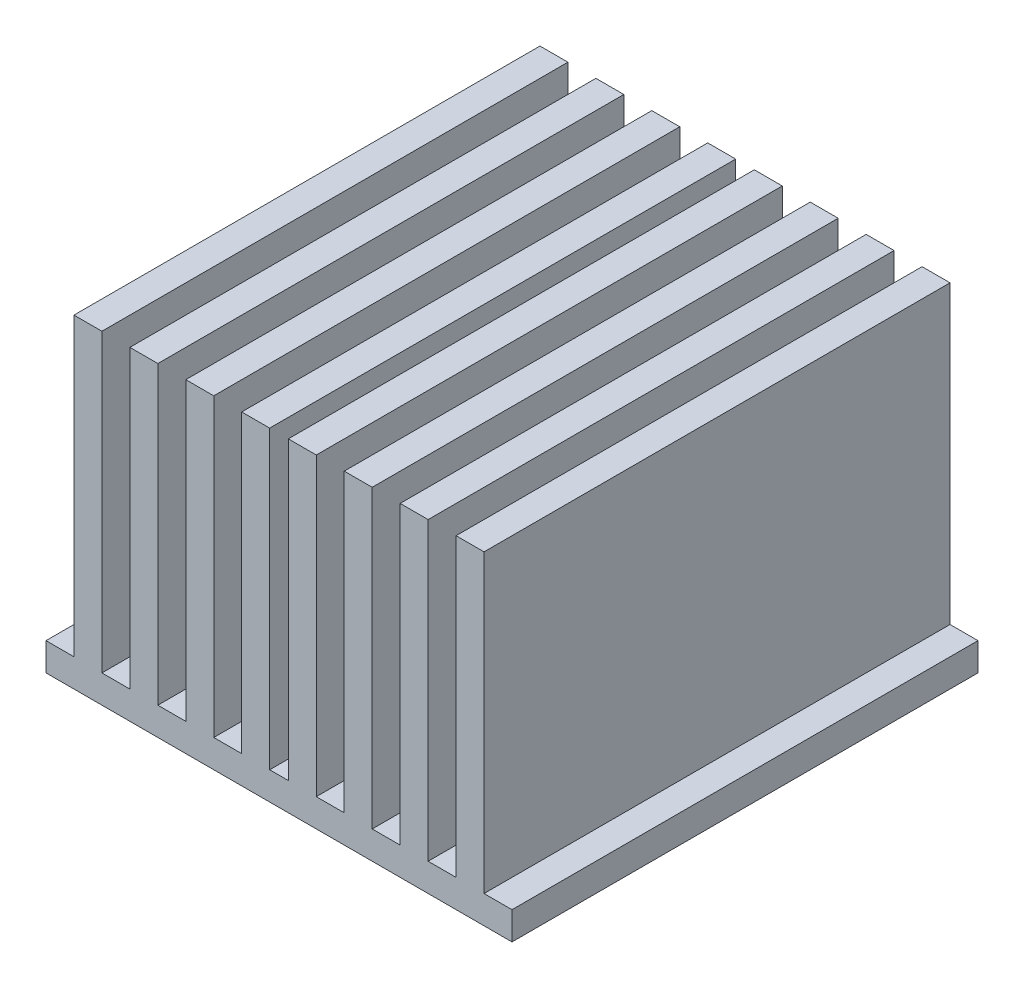
ISO-10303-21;
HEADER;
FILE_DESCRIPTION(('STEP AP214'),'2;1');
FILE_NAME('part.step','',(''),(''),'','','');
FILE_SCHEMA(('AUTOMOTIVE_DESIGN { 1 0 10303 214 1 1 1 1 }'));
ENDSEC;
DATA;
#1=APPLICATION_CONTEXT('core data for automotive mechanical design processes');
#2=APPLICATION_PROTOCOL_DEFINITION('international standard','automotive_design',2000,#1);
#3=PRODUCT_CONTEXT('',#1,'mechanical');
#4=PRODUCT('Part','Part','',(#3));
#5=PRODUCT_RELATED_PRODUCT_CATEGORY('part','',(#4));
#6=PRODUCT_DEFINITION_FORMATION('','',#4);
#7=PRODUCT_DEFINITION_CONTEXT('part definition',#1,'design');
#8=PRODUCT_DEFINITION('design','',#6,#7);
#9=PRODUCT_DEFINITION_SHAPE('','',#8);
#10=(LENGTH_UNIT() NAMED_UNIT(*) SI_UNIT(.MILLI.,.METRE.));
#11=(NAMED_UNIT(*) PLANE_ANGLE_UNIT() SI_UNIT($,.RADIAN.));
#12=(NAMED_UNIT(*) SI_UNIT($,.STERADIAN.) SOLID_ANGLE_UNIT());
#13=UNCERTAINTY_MEASURE_WITH_UNIT(LENGTH_MEASURE(1.E-05),#10,'distance_accuracy_value','');
#14=(GEOMETRIC_REPRESENTATION_CONTEXT(3) GLOBAL_UNCERTAINTY_ASSIGNED_CONTEXT((#13)) GLOBAL_UNIT_ASSIGNED_CONTEXT((#10,
#11,#12)) REPRESENTATION_CONTEXT('',''));
#15=CARTESIAN_POINT('',(0.,0.,0.));
#16=DIRECTION('',(0.,0.,1.));
#17=DIRECTION('',(1.,0.,0.));
#18=AXIS2_PLACEMENT_3D('',#15,#16,#17);
#19=CARTESIAN_POINT('',(0.,3.,0.));
#20=DIRECTION('',(0.,-1.,0.));
#21=DIRECTION('',(0.,0.,-1.));
#22=AXIS2_PLACEMENT_3D('',#19,#20,#21);
#23=PLANE('',#22);
#24=DIRECTION('',(1.,0.,0.));
#25=VECTOR('',#24,1.);
#26=CARTESIAN_POINT('',(0.,3.,0.));
#27=LINE('',#26,#25);
#28=CARTESIAN_POINT('',(29.,3.,0.));
#29=VERTEX_POINT('',#28);
#30=CARTESIAN_POINT('',(32.,3.,0.));
#31=VERTEX_POINT('',#30);
#32=EDGE_CURVE('E69',#29,#31,#27,.T.);
#33=ORIENTED_EDGE('',*,*,#32,.T.);
#34=DIRECTION('',(0.,0.,-1.));
#35=VECTOR('',#34,1.);
#36=CARTESIAN_POINT('',(32.,3.,-50.));
#37=LINE('',#36,#35);
#38=CARTESIAN_POINT('',(32.,3.,-50.));
#39=VERTEX_POINT('',#38);
#40=EDGE_CURVE('E315',#31,#39,#37,.T.);
#41=ORIENTED_EDGE('',*,*,#40,.T.);
#42=DIRECTION('',(-1.,0.,0.));
#43=VECTOR('',#42,1.);
#44=CARTESIAN_POINT('',(0.,3.,-50.));
#45=LINE('',#44,#43);
#46=CARTESIAN_POINT('',(29.,3.,-50.));
#47=VERTEX_POINT('',#46);
#48=EDGE_CURVE('E287',#39,#47,#45,.T.);
#49=ORIENTED_EDGE('',*,*,#48,.T.);
#50=DIRECTION('',(0.,0.,1.));
#51=VECTOR('',#50,1.);
#52=CARTESIAN_POINT('',(29.,3.,-50.));
#53=LINE('',#52,#51);
#54=EDGE_CURVE('E333',#47,#29,#53,.T.);
#55=ORIENTED_EDGE('',*,*,#54,.T.);
#56=EDGE_LOOP('',(#33,#41,#49,#55));
#57=FACE_BOUND('',#56,.T.);
#58=ADVANCED_FACE('F45',(#57),#23,.F.);
#59=CARTESIAN_POINT('',(24.,3.,0.));
#60=VERTEX_POINT('',#59);
#61=CARTESIAN_POINT('',(26.,3.,0.));
#62=VERTEX_POINT('',#61);
#63=EDGE_CURVE('E737',#60,#62,#27,.T.);
#64=ORIENTED_EDGE('',*,*,#63,.T.);
#65=DIRECTION('',(0.,0.,-1.));
#66=VECTOR('',#65,1.);
#67=CARTESIAN_POINT('',(26.,3.,-50.));
#68=LINE('',#67,#66);
#69=CARTESIAN_POINT('',(26.,3.,-50.));
#70=VERTEX_POINT('',#69);
#71=EDGE_CURVE('E292',#62,#70,#68,.T.);
#72=ORIENTED_EDGE('',*,*,#71,.T.);
#73=CARTESIAN_POINT('',(24.,3.,-50.));
#74=VERTEX_POINT('',#73);
#75=EDGE_CURVE('E661',#70,#74,#45,.T.);
#76=ORIENTED_EDGE('',*,*,#75,.T.);
#77=DIRECTION('',(0.,0.,-1.));
#78=VECTOR('',#77,1.);
#79=CARTESIAN_POINT('',(24.,3.,-50.));
#80=LINE('',#79,#78);
#81=EDGE_CURVE('E497',#60,#74,#80,.T.);
#82=ORIENTED_EDGE('',*,*,#81,.F.);
#83=EDGE_LOOP('',(#64,#72,#76,#82));
#84=FACE_BOUND('',#83,.T.);
#85=ADVANCED_FACE('F694',(#84),#23,.F.);
#86=CARTESIAN_POINT('',(38.,3.,-50.));
#87=VERTEX_POINT('',#86);
#88=CARTESIAN_POINT('',(35.,3.,-50.));
#89=VERTEX_POINT('',#88);
#90=EDGE_CURVE('E665',#87,#89,#45,.T.);
#91=ORIENTED_EDGE('',*,*,#90,.T.);
#92=DIRECTION('',(0.,0.,1.));
#93=VECTOR('',#92,1.);
#94=CARTESIAN_POINT('',(35.,3.,-50.));
#95=LINE('',#94,#93);
#96=CARTESIAN_POINT('',(35.,3.,0.));
#97=VERTEX_POINT('',#96);
#98=EDGE_CURVE('E61',#89,#97,#95,.T.);
#99=ORIENTED_EDGE('',*,*,#98,.T.);
#100=CARTESIAN_POINT('',(38.,3.,0.));
#101=VERTEX_POINT('',#100);
#102=EDGE_CURVE('E603',#97,#101,#27,.T.);
#103=ORIENTED_EDGE('',*,*,#102,.T.);
#104=DIRECTION('',(0.,0.,-1.));
#105=VECTOR('',#104,1.);
#106=CARTESIAN_POINT('',(38.,3.,-50.));
#107=LINE('',#106,#105);
#108=EDGE_CURVE('E365',#101,#87,#107,.T.);
#109=ORIENTED_EDGE('',*,*,#108,.T.);
#110=EDGE_LOOP('',(#91,#99,#103,#109));
#111=FACE_BOUND('',#110,.T.);
#112=ADVANCED_FACE('F691',(#111),#23,.F.);
#113=CARTESIAN_POINT('',(50.,3.,-50.));
#114=VERTEX_POINT('',#113);
#115=CARTESIAN_POINT('',(47.,3.,-50.));
#116=VERTEX_POINT('',#115);
#117=EDGE_CURVE('E607',#114,#116,#45,.T.);
#118=ORIENTED_EDGE('',*,*,#117,.T.);
#119=DIRECTION('',(0.,0.,1.));
#120=VECTOR('',#119,1.);
#121=CARTESIAN_POINT('',(47.,3.,-50.));
#122=LINE('',#121,#120);
#123=CARTESIAN_POINT('',(47.,3.,0.));
#124=VERTEX_POINT('',#123);
#125=EDGE_CURVE('E404',#116,#124,#122,.T.);
#126=ORIENTED_EDGE('',*,*,#125,.T.);
#127=CARTESIAN_POINT('',(50.,3.,0.));
#128=VERTEX_POINT('',#127);
#129=EDGE_CURVE('E596',#124,#128,#27,.T.);
#130=ORIENTED_EDGE('',*,*,#129,.T.);
#131=DIRECTION('',(0.,0.,-1.));
#132=VECTOR('',#131,1.);
#133=CARTESIAN_POINT('',(50.,3.,0.));
#134=LINE('',#133,#132);
#135=EDGE_CURVE('E601',#128,#114,#134,.T.);
#136=ORIENTED_EDGE('',*,*,#135,.T.);
#137=EDGE_LOOP('',(#118,#126,#130,#136));
#138=FACE_BOUND('',#137,.T.);
#139=ADVANCED_FACE('F693',(#138),#23,.F.);
#140=DIRECTION('',(0.,0.,1.));
#141=VECTOR('',#140,1.);
#142=CARTESIAN_POINT('',(15.,3.,-50.));
#143=LINE('',#142,#141);
#144=CARTESIAN_POINT('',(15.,3.,-50.));
#145=VERTEX_POINT('',#144);
#146=CARTESIAN_POINT('',(15.,3.,0.));
#147=VERTEX_POINT('',#146);
#148=EDGE_CURVE('E464',#145,#147,#143,.T.);
#149=ORIENTED_EDGE('',*,*,#148,.F.);
#150=CARTESIAN_POINT('',(12.,3.,-50.));
#151=VERTEX_POINT('',#150);
#152=EDGE_CURVE('E655',#145,#151,#45,.T.);
#153=ORIENTED_EDGE('',*,*,#152,.T.);
#154=DIRECTION('',(0.,0.,-1.));
#155=VECTOR('',#154,1.);
#156=CARTESIAN_POINT('',(12.,3.,-50.));
#157=LINE('',#156,#155);
#158=CARTESIAN_POINT('',(12.,3.,0.));
#159=VERTEX_POINT('',#158);
#160=EDGE_CURVE('E534',#159,#151,#157,.T.);
#161=ORIENTED_EDGE('',*,*,#160,.F.);
#162=EDGE_CURVE('E734',#159,#147,#27,.T.);
#163=ORIENTED_EDGE('',*,*,#162,.T.);
#164=EDGE_LOOP('',(#149,#153,#161,#163));
#165=FACE_BOUND('',#164,.T.);
#166=ADVANCED_FACE('F700',(#165),#23,.F.);
#167=DIRECTION('',(0.,0.,-1.));
#168=VECTOR('',#167,1.);
#169=CARTESIAN_POINT('',(18.,3.,-50.));
#170=LINE('',#169,#168);
#171=CARTESIAN_POINT('',(18.,3.,0.));
#172=VERTEX_POINT('',#171);
#173=CARTESIAN_POINT('',(18.,3.,-50.));
#174=VERTEX_POINT('',#173);
#175=EDGE_CURVE('E460',#172,#174,#170,.T.);
#176=ORIENTED_EDGE('',*,*,#175,.F.);
#177=CARTESIAN_POINT('',(21.,3.,0.));
#178=VERTEX_POINT('',#177);
#179=EDGE_CURVE('E736',#172,#178,#27,.T.);
#180=ORIENTED_EDGE('',*,*,#179,.T.);
#181=DIRECTION('',(0.,0.,1.));
#182=VECTOR('',#181,1.);
#183=CARTESIAN_POINT('',(21.,3.,-50.));
#184=LINE('',#183,#182);
#185=CARTESIAN_POINT('',(21.,3.,-50.));
#186=VERTEX_POINT('',#185);
#187=EDGE_CURVE('E501',#186,#178,#184,.T.);
#188=ORIENTED_EDGE('',*,*,#187,.F.);
#189=EDGE_CURVE('E656',#186,#174,#45,.T.);
#190=ORIENTED_EDGE('',*,*,#189,.T.);
#191=EDGE_LOOP('',(#176,#180,#188,#190));
#192=FACE_BOUND('',#191,.T.);
#193=ADVANCED_FACE('F719',(#192),#23,.F.);
#194=CARTESIAN_POINT('',(44.,3.,-50.));
#195=VERTEX_POINT('',#194);
#196=CARTESIAN_POINT('',(41.,3.,-50.));
#197=VERTEX_POINT('',#196);
#198=EDGE_CURVE('E611',#195,#197,#45,.T.);
#199=ORIENTED_EDGE('',*,*,#198,.T.);
#200=DIRECTION('',(0.,0.,1.));
#201=VECTOR('',#200,1.);
#202=CARTESIAN_POINT('',(41.,3.,-50.));
#203=LINE('',#202,#201);
#204=CARTESIAN_POINT('',(41.,3.,0.));
#205=VERTEX_POINT('',#204);
#206=EDGE_CURVE('E371',#197,#205,#203,.T.);
#207=ORIENTED_EDGE('',*,*,#206,.T.);
#208=CARTESIAN_POINT('',(44.,3.,0.));
#209=VERTEX_POINT('',#208);
#210=EDGE_CURVE('E681',#205,#209,#27,.T.);
#211=ORIENTED_EDGE('',*,*,#210,.T.);
#212=DIRECTION('',(0.,0.,-1.));
#213=VECTOR('',#212,1.);
#214=CARTESIAN_POINT('',(44.,3.,-50.));
#215=LINE('',#214,#213);
#216=EDGE_CURVE('E410',#209,#195,#215,.T.);
#217=ORIENTED_EDGE('',*,*,#216,.T.);
#218=EDGE_LOOP('',(#199,#207,#211,#217));
#219=FACE_BOUND('',#218,.T.);
#220=ADVANCED_FACE('F671',(#219),#23,.F.);
#221=DIRECTION('',(0.,0.,1.));
#222=VECTOR('',#221,1.);
#223=CARTESIAN_POINT('',(9.00000000000001,3.,-50.));
#224=LINE('',#223,#222);
#225=CARTESIAN_POINT('',(9.00000000000001,3.,-50.));
#226=VERTEX_POINT('',#225);
#227=CARTESIAN_POINT('',(9.00000000000001,3.,0.));
#228=VERTEX_POINT('',#227);
#229=EDGE_CURVE('E538',#226,#228,#224,.T.);
#230=ORIENTED_EDGE('',*,*,#229,.F.);
#231=CARTESIAN_POINT('',(6.,3.,-50.));
#232=VERTEX_POINT('',#231);
#233=EDGE_CURVE('E653',#226,#232,#45,.T.);
#234=ORIENTED_EDGE('',*,*,#233,.T.);
#235=DIRECTION('',(0.,0.,-1.));
#236=VECTOR('',#235,1.);
#237=CARTESIAN_POINT('',(6.,3.,-50.));
#238=LINE('',#237,#236);
#239=CARTESIAN_POINT('',(6.,3.,0.));
#240=VERTEX_POINT('',#239);
#241=EDGE_CURVE('E560',#240,#232,#238,.T.);
#242=ORIENTED_EDGE('',*,*,#241,.F.);
#243=EDGE_CURVE('E602',#240,#228,#27,.T.);
#244=ORIENTED_EDGE('',*,*,#243,.T.);
#245=EDGE_LOOP('',(#230,#234,#242,#244));
#246=FACE_BOUND('',#245,.T.);
#247=ADVANCED_FACE('F709',(#246),#23,.F.);
#248=DIRECTION('',(0.,0.,1.));
#249=VECTOR('',#248,1.);
#250=CARTESIAN_POINT('',(3.,3.,-50.));
#251=LINE('',#250,#249);
#252=CARTESIAN_POINT('',(3.,3.,-50.));
#253=VERTEX_POINT('',#252);
#254=CARTESIAN_POINT('',(3.,3.,0.));
#255=VERTEX_POINT('',#254);
#256=EDGE_CURVE('E543',#253,#255,#251,.T.);
#257=ORIENTED_EDGE('',*,*,#256,.F.);
#258=CARTESIAN_POINT('',(0.,3.,-50.));
#259=VERTEX_POINT('',#258);
#260=EDGE_CURVE('E606',#253,#259,#45,.T.);
#261=ORIENTED_EDGE('',*,*,#260,.T.);
#262=DIRECTION('',(0.,0.,1.));
#263=VECTOR('',#262,1.);
#264=CARTESIAN_POINT('',(0.,3.,0.));
#265=LINE('',#264,#263);
#266=CARTESIAN_POINT('',(0.,3.,0.));
#267=VERTEX_POINT('',#266);
#268=EDGE_CURVE('E592',#259,#267,#265,.T.);
#269=ORIENTED_EDGE('',*,*,#268,.T.);
#270=EDGE_CURVE('E598',#267,#255,#27,.T.);
#271=ORIENTED_EDGE('',*,*,#270,.T.);
#272=EDGE_LOOP('',(#257,#261,#269,#271));
#273=FACE_BOUND('',#272,.T.);
#274=ADVANCED_FACE('F650',(#273),#23,.F.);
#275=CARTESIAN_POINT('',(0.,3.,0.));
#276=DIRECTION('',(1.,0.,0.));
#277=DIRECTION('',(0.,0.,-1.));
#278=AXIS2_PLACEMENT_3D('',#275,#276,#277);
#279=PLANE('',#278);
#280=DIRECTION('',(0.,0.,1.));
#281=VECTOR('',#280,1.);
#282=CARTESIAN_POINT('',(0.,0.,0.));
#283=LINE('',#282,#281);
#284=CARTESIAN_POINT('',(0.,0.,-50.));
#285=VERTEX_POINT('',#284);
#286=CARTESIAN_POINT('',(0.,0.,0.));
#287=VERTEX_POINT('',#286);
#288=EDGE_CURVE('E591',#285,#287,#283,.T.);
#289=ORIENTED_EDGE('',*,*,#288,.T.);
#290=DIRECTION('',(0.,-1.,0.));
#291=VECTOR('',#290,1.);
#292=CARTESIAN_POINT('',(0.,3.,0.));
#293=LINE('',#292,#291);
#294=EDGE_CURVE('E11',#267,#287,#293,.T.);
#295=ORIENTED_EDGE('',*,*,#294,.F.);
#296=ORIENTED_EDGE('',*,*,#268,.F.);
#297=DIRECTION('',(0.,-1.,0.));
#298=VECTOR('',#297,1.);
#299=CARTESIAN_POINT('',(0.,3.,-50.));
#300=LINE('',#299,#298);
#301=EDGE_CURVE('E610',#259,#285,#300,.T.);
#302=ORIENTED_EDGE('',*,*,#301,.T.);
#303=EDGE_LOOP('',(#289,#295,#296,#302));
#304=FACE_BOUND('',#303,.T.);
#305=ADVANCED_FACE('F47',(#304),#279,.F.);
#306=CARTESIAN_POINT('',(0.,3.,0.));
#307=DIRECTION('',(0.,0.,-1.));
#308=DIRECTION('',(-1.,0.,0.));
#309=AXIS2_PLACEMENT_3D('',#306,#307,#308);
#310=PLANE('',#309);
#311=DIRECTION('',(1.,0.,0.));
#312=VECTOR('',#311,1.);
#313=CARTESIAN_POINT('',(0.,0.,0.));
#314=LINE('',#313,#312);
#315=CARTESIAN_POINT('',(50.,0.,0.));
#316=VERTEX_POINT('',#315);
#317=EDGE_CURVE('E615',#287,#316,#314,.T.);
#318=ORIENTED_EDGE('',*,*,#317,.T.);
#319=DIRECTION('',(0.,-1.,0.));
#320=VECTOR('',#319,1.);
#321=CARTESIAN_POINT('',(50.,3.,0.));
#322=LINE('',#321,#320);
#323=EDGE_CURVE('E54',#128,#316,#322,.T.);
#324=ORIENTED_EDGE('',*,*,#323,.F.);
#325=ORIENTED_EDGE('',*,*,#129,.F.);
#326=DIRECTION('',(0.,-1.,0.));
#327=VECTOR('',#326,1.);
#328=CARTESIAN_POINT('',(47.,34.75,0.));
#329=LINE('',#328,#327);
#330=CARTESIAN_POINT('',(47.,34.75,0.));
#331=VERTEX_POINT('',#330);
#332=EDGE_CURVE('E422',#331,#124,#329,.T.);
#333=ORIENTED_EDGE('',*,*,#332,.F.);
#334=DIRECTION('',(-1.,0.,0.));
#335=VECTOR('',#334,1.);
#336=CARTESIAN_POINT('',(47.,34.75,0.));
#337=LINE('',#336,#335);
#338=CARTESIAN_POINT('',(44.,34.75,0.));
#339=VERTEX_POINT('',#338);
#340=EDGE_CURVE('E418',#331,#339,#337,.T.);
#341=ORIENTED_EDGE('',*,*,#340,.T.);
#342=DIRECTION('',(0.,-1.,0.));
#343=VECTOR('',#342,1.);
#344=CARTESIAN_POINT('',(44.,34.75,0.));
#345=LINE('',#344,#343);
#346=EDGE_CURVE('E431',#339,#209,#345,.T.);
#347=ORIENTED_EDGE('',*,*,#346,.T.);
#348=ORIENTED_EDGE('',*,*,#210,.F.);
#349=DIRECTION('',(0.,-1.,0.));
#350=VECTOR('',#349,1.);
#351=CARTESIAN_POINT('',(41.,34.75,0.));
#352=LINE('',#351,#350);
#353=CARTESIAN_POINT('',(41.,34.75,0.));
#354=VERTEX_POINT('',#353);
#355=EDGE_CURVE('E392',#354,#205,#352,.T.);
#356=ORIENTED_EDGE('',*,*,#355,.F.);
#357=DIRECTION('',(-1.,0.,0.));
#358=VECTOR('',#357,1.);
#359=CARTESIAN_POINT('',(41.,34.75,0.));
#360=LINE('',#359,#358);
#361=CARTESIAN_POINT('',(38.,34.75,0.));
#362=VERTEX_POINT('',#361);
#363=EDGE_CURVE('E375',#354,#362,#360,.T.);
#364=ORIENTED_EDGE('',*,*,#363,.T.);
#365=DIRECTION('',(0.,-1.,0.));
#366=VECTOR('',#365,1.);
#367=CARTESIAN_POINT('',(38.,34.75,0.));
#368=LINE('',#367,#366);
#369=EDGE_CURVE('E396',#362,#101,#368,.T.);
#370=ORIENTED_EDGE('',*,*,#369,.T.);
#371=ORIENTED_EDGE('',*,*,#102,.F.);
#372=DIRECTION('',(0.,-1.,0.));
#373=VECTOR('',#372,1.);
#374=CARTESIAN_POINT('',(35.,34.75,0.));
#375=LINE('',#374,#373);
#376=CARTESIAN_POINT('',(35.,34.75,0.));
#377=VERTEX_POINT('',#376);
#378=EDGE_CURVE('E322',#377,#97,#375,.T.);
#379=ORIENTED_EDGE('',*,*,#378,.F.);
#380=DIRECTION('',(-1.,0.,0.));
#381=VECTOR('',#380,1.);
#382=CARTESIAN_POINT('',(35.,34.75,0.));
#383=LINE('',#382,#381);
#384=CARTESIAN_POINT('',(32.,34.75,0.));
#385=VERTEX_POINT('',#384);
#386=EDGE_CURVE('E307',#377,#385,#383,.T.);
#387=ORIENTED_EDGE('',*,*,#386,.T.);
#388=DIRECTION('',(0.,-1.,0.));
#389=VECTOR('',#388,1.);
#390=CARTESIAN_POINT('',(32.,34.75,0.));
#391=LINE('',#390,#389);
#392=EDGE_CURVE('E293',#385,#31,#391,.T.);
#393=ORIENTED_EDGE('',*,*,#392,.T.);
#394=ORIENTED_EDGE('',*,*,#32,.F.);
#395=DIRECTION('',(0.,-1.,0.));
#396=VECTOR('',#395,1.);
#397=CARTESIAN_POINT('',(29.,34.75,0.));
#398=LINE('',#397,#396);
#399=CARTESIAN_POINT('',(29.,34.75,0.));
#400=VERTEX_POINT('',#399);
#401=EDGE_CURVE('E353',#400,#29,#398,.T.);
#402=ORIENTED_EDGE('',*,*,#401,.F.);
#403=DIRECTION('',(-1.,0.,0.));
#404=VECTOR('',#403,1.);
#405=CARTESIAN_POINT('',(29.,34.75,0.));
#406=LINE('',#405,#404);
#407=CARTESIAN_POINT('',(26.,34.75,0.));
#408=VERTEX_POINT('',#407);
#409=EDGE_CURVE('E337',#400,#408,#406,.T.);
#410=ORIENTED_EDGE('',*,*,#409,.T.);
#411=DIRECTION('',(0.,-1.,0.));
#412=VECTOR('',#411,1.);
#413=CARTESIAN_POINT('',(26.,34.75,0.));
#414=LINE('',#413,#412);
#415=EDGE_CURVE('E357',#408,#62,#414,.T.);
#416=ORIENTED_EDGE('',*,*,#415,.T.);
#417=ORIENTED_EDGE('',*,*,#63,.F.);
#418=DIRECTION('',(0.,-1.,0.));
#419=VECTOR('',#418,1.);
#420=CARTESIAN_POINT('',(24.,34.75,0.));
#421=LINE('',#420,#419);
#422=CARTESIAN_POINT('',(24.,34.75,0.));
#423=VERTEX_POINT('',#422);
#424=EDGE_CURVE('E488',#423,#60,#421,.T.);
#425=ORIENTED_EDGE('',*,*,#424,.F.);
#426=DIRECTION('',(1.,0.,0.));
#427=VECTOR('',#426,1.);
#428=CARTESIAN_POINT('',(21.,34.75,0.));
#429=LINE('',#428,#427);
#430=CARTESIAN_POINT('',(21.,34.75,0.));
#431=VERTEX_POINT('',#430);
#432=EDGE_CURVE('E509',#431,#423,#429,.T.);
#433=ORIENTED_EDGE('',*,*,#432,.F.);
#434=DIRECTION('',(0.,-1.,0.));
#435=VECTOR('',#434,1.);
#436=CARTESIAN_POINT('',(21.,34.75,0.));
#437=LINE('',#436,#435);
#438=EDGE_CURVE('E484',#431,#178,#437,.T.);
#439=ORIENTED_EDGE('',*,*,#438,.T.);
#440=ORIENTED_EDGE('',*,*,#179,.F.);
#441=DIRECTION('',(0.,-1.,0.));
#442=VECTOR('',#441,1.);
#443=CARTESIAN_POINT('',(18.,34.75,0.));
#444=LINE('',#443,#442);
#445=CARTESIAN_POINT('',(18.,34.75,0.));
#446=VERTEX_POINT('',#445);
#447=EDGE_CURVE('E451',#446,#172,#444,.T.);
#448=ORIENTED_EDGE('',*,*,#447,.F.);
#449=DIRECTION('',(1.,0.,0.));
#450=VECTOR('',#449,1.);
#451=CARTESIAN_POINT('',(15.,34.75,0.));
#452=LINE('',#451,#450);
#453=CARTESIAN_POINT('',(15.,34.75,0.));
#454=VERTEX_POINT('',#453);
#455=EDGE_CURVE('E472',#454,#446,#452,.T.);
#456=ORIENTED_EDGE('',*,*,#455,.F.);
#457=DIRECTION('',(0.,-1.,0.));
#458=VECTOR('',#457,1.);
#459=CARTESIAN_POINT('',(15.,34.75,0.));
#460=LINE('',#459,#458);
#461=EDGE_CURVE('E447',#454,#147,#460,.T.);
#462=ORIENTED_EDGE('',*,*,#461,.T.);
#463=ORIENTED_EDGE('',*,*,#162,.F.);
#464=DIRECTION('',(0.,-1.,0.));
#465=VECTOR('',#464,1.);
#466=CARTESIAN_POINT('',(12.,34.75,0.));
#467=LINE('',#466,#465);
#468=CARTESIAN_POINT('',(12.,34.75,0.));
#469=VERTEX_POINT('',#468);
#470=EDGE_CURVE('E525',#469,#159,#467,.T.);
#471=ORIENTED_EDGE('',*,*,#470,.F.);
#472=DIRECTION('',(1.,0.,0.));
#473=VECTOR('',#472,1.);
#474=CARTESIAN_POINT('',(9.00000000000001,34.75,0.));
#475=LINE('',#474,#473);
#476=CARTESIAN_POINT('',(9.00000000000001,34.75,0.));
#477=VERTEX_POINT('',#476);
#478=EDGE_CURVE('E546',#477,#469,#475,.T.);
#479=ORIENTED_EDGE('',*,*,#478,.F.);
#480=DIRECTION('',(0.,-1.,0.));
#481=VECTOR('',#480,1.);
#482=CARTESIAN_POINT('',(9.00000000000001,34.75,0.));
#483=LINE('',#482,#481);
#484=EDGE_CURVE('E521',#477,#228,#483,.T.);
#485=ORIENTED_EDGE('',*,*,#484,.T.);
#486=ORIENTED_EDGE('',*,*,#243,.F.);
#487=DIRECTION('',(0.,-1.,0.));
#488=VECTOR('',#487,1.);
#489=CARTESIAN_POINT('',(6.00000000000001,34.75,0.));
#490=LINE('',#489,#488);
#491=CARTESIAN_POINT('',(6.00000000000001,34.75,0.));
#492=VERTEX_POINT('',#491);
#493=EDGE_CURVE('E583',#492,#240,#490,.T.);
#494=ORIENTED_EDGE('',*,*,#493,.F.);
#495=DIRECTION('',(1.,0.,0.));
#496=VECTOR('',#495,1.);
#497=CARTESIAN_POINT('',(3.00000000000001,34.75,0.));
#498=LINE('',#497,#496);
#499=CARTESIAN_POINT('',(3.00000000000001,34.75,0.));
#500=VERTEX_POINT('',#499);
#501=EDGE_CURVE('E559',#500,#492,#498,.T.);
#502=ORIENTED_EDGE('',*,*,#501,.F.);
#503=DIRECTION('',(0.,-1.,0.));
#504=VECTOR('',#503,1.);
#505=CARTESIAN_POINT('',(3.00000000000001,34.75,0.));
#506=LINE('',#505,#504);
#507=EDGE_CURVE('E587',#500,#255,#506,.T.);
#508=ORIENTED_EDGE('',*,*,#507,.T.);
#509=ORIENTED_EDGE('',*,*,#270,.F.);
#510=ORIENTED_EDGE('',*,*,#294,.T.);
#511=EDGE_LOOP('',(#318,#324,#325,#333,#341,#347,#348,#356,#364,#370,#371,#379,#387,#393,#394,
#402,#410,#416,#417,#425,#433,#439,#440,#448,#456,#462,#463,#471,#479,#485,#486,#494,#502,#508,
#509,#510));
#512=FACE_BOUND('',#511,.T.);
#513=ADVANCED_FACE('F680',(#512),#310,.F.);
#514=CARTESIAN_POINT('',(50.,3.,0.));
#515=DIRECTION('',(-1.,0.,0.));
#516=DIRECTION('',(0.,0.,1.));
#517=AXIS2_PLACEMENT_3D('',#514,#515,#516);
#518=PLANE('',#517);
#519=DIRECTION('',(0.,0.,-1.));
#520=VECTOR('',#519,1.);
#521=CARTESIAN_POINT('',(50.,0.,0.));
#522=LINE('',#521,#520);
#523=CARTESIAN_POINT('',(50.,0.,-50.));
#524=VERTEX_POINT('',#523);
#525=EDGE_CURVE('E618',#316,#524,#522,.T.);
#526=ORIENTED_EDGE('',*,*,#525,.T.);
#527=DIRECTION('',(0.,-1.,0.));
#528=VECTOR('',#527,1.);
#529=CARTESIAN_POINT('',(50.,3.,-50.));
#530=LINE('',#529,#528);
#531=EDGE_CURVE('E626',#114,#524,#530,.T.);
#532=ORIENTED_EDGE('',*,*,#531,.F.);
#533=ORIENTED_EDGE('',*,*,#135,.F.);
#534=ORIENTED_EDGE('',*,*,#323,.T.);
#535=EDGE_LOOP('',(#526,#532,#533,#534));
#536=FACE_BOUND('',#535,.T.);
#537=ADVANCED_FACE('F635',(#536),#518,.F.);
#538=CARTESIAN_POINT('',(0.,3.,-50.));
#539=DIRECTION('',(0.,0.,1.));
#540=DIRECTION('',(1.,0.,0.));
#541=AXIS2_PLACEMENT_3D('',#538,#539,#540);
#542=PLANE('',#541);
#543=DIRECTION('',(-1.,0.,0.));
#544=VECTOR('',#543,1.);
#545=CARTESIAN_POINT('',(0.,0.,-50.));
#546=LINE('',#545,#544);
#547=EDGE_CURVE('E597',#524,#285,#546,.T.);
#548=ORIENTED_EDGE('',*,*,#547,.T.);
#549=ORIENTED_EDGE('',*,*,#301,.F.);
#550=ORIENTED_EDGE('',*,*,#260,.F.);
#551=DIRECTION('',(0.,-1.,0.));
#552=VECTOR('',#551,1.);
#553=CARTESIAN_POINT('',(3.,34.75,-50.));
#554=LINE('',#553,#552);
#555=CARTESIAN_POINT('',(3.,34.75,-50.));
#556=VERTEX_POINT('',#555);
#557=EDGE_CURVE('E569',#556,#253,#554,.T.);
#558=ORIENTED_EDGE('',*,*,#557,.F.);
#559=DIRECTION('',(-1.,0.,0.));
#560=VECTOR('',#559,1.);
#561=CARTESIAN_POINT('',(3.,34.75,-50.));
#562=LINE('',#561,#560);
#563=CARTESIAN_POINT('',(6.,34.75,-50.));
#564=VERTEX_POINT('',#563);
#565=EDGE_CURVE('E566',#564,#556,#562,.T.);
#566=ORIENTED_EDGE('',*,*,#565,.F.);
#567=DIRECTION('',(0.,-1.,0.));
#568=VECTOR('',#567,1.);
#569=CARTESIAN_POINT('',(6.,34.75,-50.));
#570=LINE('',#569,#568);
#571=EDGE_CURVE('E579',#564,#232,#570,.T.);
#572=ORIENTED_EDGE('',*,*,#571,.T.);
#573=ORIENTED_EDGE('',*,*,#233,.F.);
#574=DIRECTION('',(0.,-1.,0.));
#575=VECTOR('',#574,1.);
#576=CARTESIAN_POINT('',(9.00000000000001,34.75,-50.));
#577=LINE('',#576,#575);
#578=CARTESIAN_POINT('',(9.00000000000001,34.75,-50.));
#579=VERTEX_POINT('',#578);
#580=EDGE_CURVE('E506',#579,#226,#577,.T.);
#581=ORIENTED_EDGE('',*,*,#580,.F.);
#582=DIRECTION('',(-1.,0.,0.));
#583=VECTOR('',#582,1.);
#584=CARTESIAN_POINT('',(9.00000000000001,34.75,-50.));
#585=LINE('',#584,#583);
#586=CARTESIAN_POINT('',(12.,34.75,-50.));
#587=VERTEX_POINT('',#586);
#588=EDGE_CURVE('E539',#587,#579,#585,.T.);
#589=ORIENTED_EDGE('',*,*,#588,.F.);
#590=DIRECTION('',(0.,-1.,0.));
#591=VECTOR('',#590,1.);
#592=CARTESIAN_POINT('',(12.,34.75,-50.));
#593=LINE('',#592,#591);
#594=EDGE_CURVE('E529',#587,#151,#593,.T.);
#595=ORIENTED_EDGE('',*,*,#594,.T.);
#596=ORIENTED_EDGE('',*,*,#152,.F.);
#597=DIRECTION('',(0.,-1.,0.));
#598=VECTOR('',#597,1.);
#599=CARTESIAN_POINT('',(15.,34.75,-50.));
#600=LINE('',#599,#598);
#601=CARTESIAN_POINT('',(15.,34.75,-50.));
#602=VERTEX_POINT('',#601);
#603=EDGE_CURVE('E443',#602,#145,#600,.T.);
#604=ORIENTED_EDGE('',*,*,#603,.F.);
#605=DIRECTION('',(-1.,0.,0.));
#606=VECTOR('',#605,1.);
#607=CARTESIAN_POINT('',(15.,34.75,-50.));
#608=LINE('',#607,#606);
#609=CARTESIAN_POINT('',(18.,34.75,-50.));
#610=VERTEX_POINT('',#609);
#611=EDGE_CURVE('E465',#610,#602,#608,.T.);
#612=ORIENTED_EDGE('',*,*,#611,.F.);
#613=DIRECTION('',(0.,-1.,0.));
#614=VECTOR('',#613,1.);
#615=CARTESIAN_POINT('',(18.,34.75,-50.));
#616=LINE('',#615,#614);
#617=EDGE_CURVE('E455',#610,#174,#616,.T.);
#618=ORIENTED_EDGE('',*,*,#617,.T.);
#619=ORIENTED_EDGE('',*,*,#189,.F.);
#620=DIRECTION('',(0.,-1.,0.));
#621=VECTOR('',#620,1.);
#622=CARTESIAN_POINT('',(21.,34.75,-50.));
#623=LINE('',#622,#621);
#624=CARTESIAN_POINT('',(21.,34.75,-50.));
#625=VERTEX_POINT('',#624);
#626=EDGE_CURVE('E469',#625,#186,#623,.T.);
#627=ORIENTED_EDGE('',*,*,#626,.F.);
#628=DIRECTION('',(-1.,0.,0.));
#629=VECTOR('',#628,1.);
#630=CARTESIAN_POINT('',(21.,34.75,-50.));
#631=LINE('',#630,#629);
#632=CARTESIAN_POINT('',(24.,34.75,-50.));
#633=VERTEX_POINT('',#632);
#634=EDGE_CURVE('E502',#633,#625,#631,.T.);
#635=ORIENTED_EDGE('',*,*,#634,.F.);
#636=DIRECTION('',(0.,-1.,0.));
#637=VECTOR('',#636,1.);
#638=CARTESIAN_POINT('',(24.,34.75,-50.));
#639=LINE('',#638,#637);
#640=EDGE_CURVE('E492',#633,#74,#639,.T.);
#641=ORIENTED_EDGE('',*,*,#640,.T.);
#642=ORIENTED_EDGE('',*,*,#75,.F.);
#643=DIRECTION('',(0.,-1.,0.));
#644=VECTOR('',#643,1.);
#645=CARTESIAN_POINT('',(26.,34.75,-50.));
#646=LINE('',#645,#644);
#647=CARTESIAN_POINT('',(26.,34.75,-50.));
#648=VERTEX_POINT('',#647);
#649=EDGE_CURVE('E361',#648,#70,#646,.T.);
#650=ORIENTED_EDGE('',*,*,#649,.F.);
#651=DIRECTION('',(1.,0.,0.));
#652=VECTOR('',#651,1.);
#653=CARTESIAN_POINT('',(29.,34.75,-50.));
#654=LINE('',#653,#652);
#655=CARTESIAN_POINT('',(29.,34.75,-50.));
#656=VERTEX_POINT('',#655);
#657=EDGE_CURVE('E328',#648,#656,#654,.T.);
#658=ORIENTED_EDGE('',*,*,#657,.T.);
#659=DIRECTION('',(0.,-1.,0.));
#660=VECTOR('',#659,1.);
#661=CARTESIAN_POINT('',(29.,34.75,-50.));
#662=LINE('',#661,#660);
#663=EDGE_CURVE('E345',#656,#47,#662,.T.);
#664=ORIENTED_EDGE('',*,*,#663,.T.);
#665=ORIENTED_EDGE('',*,*,#48,.F.);
#666=DIRECTION('',(0.,-1.,0.));
#667=VECTOR('',#666,1.);
#668=CARTESIAN_POINT('',(32.,34.75,-50.));
#669=LINE('',#668,#667);
#670=CARTESIAN_POINT('',(32.,34.75,-50.));
#671=VERTEX_POINT('',#670);
#672=EDGE_CURVE('E280',#671,#39,#669,.T.);
#673=ORIENTED_EDGE('',*,*,#672,.F.);
#674=DIRECTION('',(1.,0.,0.));
#675=VECTOR('',#674,1.);
#676=CARTESIAN_POINT('',(35.,34.75,-50.));
#677=LINE('',#676,#675);
#678=CARTESIAN_POINT('',(35.,34.75,-50.));
#679=VERTEX_POINT('',#678);
#680=EDGE_CURVE('E284',#671,#679,#677,.T.);
#681=ORIENTED_EDGE('',*,*,#680,.T.);
#682=DIRECTION('',(0.,-1.,0.));
#683=VECTOR('',#682,1.);
#684=CARTESIAN_POINT('',(35.,34.75,-50.));
#685=LINE('',#684,#683);
#686=EDGE_CURVE('E314',#679,#89,#685,.T.);
#687=ORIENTED_EDGE('',*,*,#686,.T.);
#688=ORIENTED_EDGE('',*,*,#90,.F.);
#689=DIRECTION('',(0.,-1.,0.));
#690=VECTOR('',#689,1.);
#691=CARTESIAN_POINT('',(38.,34.75,-50.));
#692=LINE('',#691,#690);
#693=CARTESIAN_POINT('',(38.,34.75,-50.));
#694=VERTEX_POINT('',#693);
#695=EDGE_CURVE('E400',#694,#87,#692,.T.);
#696=ORIENTED_EDGE('',*,*,#695,.F.);
#697=DIRECTION('',(1.,0.,0.));
#698=VECTOR('',#697,1.);
#699=CARTESIAN_POINT('',(41.,34.75,-50.));
#700=LINE('',#699,#698);
#701=CARTESIAN_POINT('',(41.,34.75,-50.));
#702=VERTEX_POINT('',#701);
#703=EDGE_CURVE('E366',#694,#702,#700,.T.);
#704=ORIENTED_EDGE('',*,*,#703,.T.);
#705=DIRECTION('',(0.,-1.,0.));
#706=VECTOR('',#705,1.);
#707=CARTESIAN_POINT('',(41.,34.75,-50.));
#708=LINE('',#707,#706);
#709=EDGE_CURVE('E383',#702,#197,#708,.T.);
#710=ORIENTED_EDGE('',*,*,#709,.T.);
#711=ORIENTED_EDGE('',*,*,#198,.F.);
#712=DIRECTION('',(0.,-1.,0.));
#713=VECTOR('',#712,1.);
#714=CARTESIAN_POINT('',(44.,34.75,-50.));
#715=LINE('',#714,#713);
#716=CARTESIAN_POINT('',(44.,34.75,-50.));
#717=VERTEX_POINT('',#716);
#718=EDGE_CURVE('E435',#717,#195,#715,.T.);
#719=ORIENTED_EDGE('',*,*,#718,.F.);
#720=DIRECTION('',(1.,0.,0.));
#721=VECTOR('',#720,1.);
#722=CARTESIAN_POINT('',(47.,34.75,-50.));
#723=LINE('',#722,#721);
#724=CARTESIAN_POINT('',(47.,34.75,-50.));
#725=VERTEX_POINT('',#724);
#726=EDGE_CURVE('E409',#717,#725,#723,.T.);
#727=ORIENTED_EDGE('',*,*,#726,.T.);
#728=DIRECTION('',(0.,-1.,0.));
#729=VECTOR('',#728,1.);
#730=CARTESIAN_POINT('',(47.,34.75,-50.));
#731=LINE('',#730,#729);
#732=EDGE_CURVE('E439',#725,#116,#731,.T.);
#733=ORIENTED_EDGE('',*,*,#732,.T.);
#734=ORIENTED_EDGE('',*,*,#117,.F.);
#735=ORIENTED_EDGE('',*,*,#531,.T.);
#736=EDGE_LOOP('',(#548,#549,#550,#558,#566,#572,#573,#581,#589,#595,#596,#604,#612,#618,#619,
#627,#635,#641,#642,#650,#658,#664,#665,#673,#681,#687,#688,#696,#704,#710,#711,#719,#727,#733,
#734,#735));
#737=FACE_BOUND('',#736,.T.);
#738=ADVANCED_FACE('F282',(#737),#542,.F.);
#739=CARTESIAN_POINT('',(0.,0.,0.));
#740=DIRECTION('',(0.,-1.,0.));
#741=DIRECTION('',(0.,0.,-1.));
#742=AXIS2_PLACEMENT_3D('',#739,#740,#741);
#743=PLANE('',#742);
#744=ORIENTED_EDGE('',*,*,#288,.F.);
#745=ORIENTED_EDGE('',*,*,#547,.F.);
#746=ORIENTED_EDGE('',*,*,#525,.F.);
#747=ORIENTED_EDGE('',*,*,#317,.F.);
#748=EDGE_LOOP('',(#744,#745,#746,#747));
#749=FACE_BOUND('',#748,.T.);
#750=ADVANCED_FACE('F642',(#749),#743,.T.);
#751=CARTESIAN_POINT('',(3.,34.75,-50.));
#752=DIRECTION('',(1.,0.,0.));
#753=DIRECTION('',(0.,0.,-1.));
#754=AXIS2_PLACEMENT_3D('',#751,#752,#753);
#755=PLANE('',#754);
#756=ORIENTED_EDGE('',*,*,#256,.T.);
#757=ORIENTED_EDGE('',*,*,#507,.F.);
#758=DIRECTION('',(0.,0.,1.));
#759=VECTOR('',#758,1.);
#760=CARTESIAN_POINT('',(3.,34.75,-50.));
#761=LINE('',#760,#759);
#762=EDGE_CURVE('E555',#556,#500,#761,.T.);
#763=ORIENTED_EDGE('',*,*,#762,.F.);
#764=ORIENTED_EDGE('',*,*,#557,.T.);
#765=EDGE_LOOP('',(#756,#757,#763,#764));
#766=FACE_BOUND('',#765,.T.);
#767=ADVANCED_FACE('F806',(#766),#755,.F.);
#768=CARTESIAN_POINT('',(6.,34.75,-50.));
#769=DIRECTION('',(-1.,0.,0.));
#770=DIRECTION('',(0.,0.,1.));
#771=AXIS2_PLACEMENT_3D('',#768,#769,#770);
#772=PLANE('',#771);
#773=ORIENTED_EDGE('',*,*,#241,.T.);
#774=ORIENTED_EDGE('',*,*,#571,.F.);
#775=DIRECTION('',(0.,0.,-1.));
#776=VECTOR('',#775,1.);
#777=CARTESIAN_POINT('',(6.,34.75,-50.));
#778=LINE('',#777,#776);
#779=EDGE_CURVE('E563',#492,#564,#778,.T.);
#780=ORIENTED_EDGE('',*,*,#779,.F.);
#781=ORIENTED_EDGE('',*,*,#493,.T.);
#782=EDGE_LOOP('',(#773,#774,#780,#781));
#783=FACE_BOUND('',#782,.T.);
#784=ADVANCED_FACE('F730',(#783),#772,.F.);
#785=CARTESIAN_POINT('',(0.,34.75,0.));
#786=DIRECTION('',(0.,1.,0.));
#787=DIRECTION('',(0.,0.,1.));
#788=AXIS2_PLACEMENT_3D('',#785,#786,#787);
#789=PLANE('',#788);
#790=ORIENTED_EDGE('',*,*,#762,.T.);
#791=ORIENTED_EDGE('',*,*,#501,.T.);
#792=ORIENTED_EDGE('',*,*,#779,.T.);
#793=ORIENTED_EDGE('',*,*,#565,.T.);
#794=EDGE_LOOP('',(#790,#791,#792,#793));
#795=FACE_BOUND('',#794,.T.);
#796=ADVANCED_FACE('F795',(#795),#789,.T.);
#797=CARTESIAN_POINT('',(9.00000000000001,34.75,-50.));
#798=DIRECTION('',(1.,0.,0.));
#799=DIRECTION('',(0.,0.,-1.));
#800=AXIS2_PLACEMENT_3D('',#797,#798,#799);
#801=PLANE('',#800);
#802=ORIENTED_EDGE('',*,*,#229,.T.);
#803=ORIENTED_EDGE('',*,*,#484,.F.);
#804=DIRECTION('',(0.,0.,1.));
#805=VECTOR('',#804,1.);
#806=CARTESIAN_POINT('',(9.00000000000001,34.75,-50.));
#807=LINE('',#806,#805);
#808=EDGE_CURVE('E549',#579,#477,#807,.T.);
#809=ORIENTED_EDGE('',*,*,#808,.F.);
#810=ORIENTED_EDGE('',*,*,#580,.T.);
#811=EDGE_LOOP('',(#802,#803,#809,#810));
#812=FACE_BOUND('',#811,.T.);
#813=ADVANCED_FACE('F724',(#812),#801,.F.);
#814=CARTESIAN_POINT('',(12.,34.75,-50.));
#815=DIRECTION('',(-1.,0.,0.));
#816=DIRECTION('',(0.,0.,1.));
#817=AXIS2_PLACEMENT_3D('',#814,#815,#816);
#818=PLANE('',#817);
#819=ORIENTED_EDGE('',*,*,#160,.T.);
#820=ORIENTED_EDGE('',*,*,#594,.F.);
#821=DIRECTION('',(0.,0.,-1.));
#822=VECTOR('',#821,1.);
#823=CARTESIAN_POINT('',(12.,34.75,-50.));
#824=LINE('',#823,#822);
#825=EDGE_CURVE('E533',#469,#587,#824,.T.);
#826=ORIENTED_EDGE('',*,*,#825,.F.);
#827=ORIENTED_EDGE('',*,*,#470,.T.);
#828=EDGE_LOOP('',(#819,#820,#826,#827));
#829=FACE_BOUND('',#828,.T.);
#830=ADVANCED_FACE('F794',(#829),#818,.F.);
#831=CARTESIAN_POINT('',(0.,34.75,0.));
#832=DIRECTION('',(0.,-1.,0.));
#833=DIRECTION('',(0.,0.,-1.));
#834=AXIS2_PLACEMENT_3D('',#831,#832,#833);
#835=PLANE('',#834);
#836=ORIENTED_EDGE('',*,*,#588,.T.);
#837=ORIENTED_EDGE('',*,*,#808,.T.);
#838=ORIENTED_EDGE('',*,*,#478,.T.);
#839=ORIENTED_EDGE('',*,*,#825,.T.);
#840=EDGE_LOOP('',(#836,#837,#838,#839));
#841=FACE_BOUND('',#840,.T.);
#842=ADVANCED_FACE('F784',(#841),#835,.F.);
#843=CARTESIAN_POINT('',(21.,34.75,-50.));
#844=DIRECTION('',(1.,0.,0.));
#845=DIRECTION('',(0.,0.,-1.));
#846=AXIS2_PLACEMENT_3D('',#843,#844,#845);
#847=PLANE('',#846);
#848=ORIENTED_EDGE('',*,*,#187,.T.);
#849=ORIENTED_EDGE('',*,*,#438,.F.);
#850=DIRECTION('',(0.,0.,1.));
#851=VECTOR('',#850,1.);
#852=CARTESIAN_POINT('',(21.,34.75,-50.));
#853=LINE('',#852,#851);
#854=EDGE_CURVE('E512',#625,#431,#853,.T.);
#855=ORIENTED_EDGE('',*,*,#854,.F.);
#856=ORIENTED_EDGE('',*,*,#626,.T.);
#857=EDGE_LOOP('',(#848,#849,#855,#856));
#858=FACE_BOUND('',#857,.T.);
#859=ADVANCED_FACE('F780',(#858),#847,.F.);
#860=CARTESIAN_POINT('',(24.,34.75,-50.));
#861=DIRECTION('',(-1.,0.,0.));
#862=DIRECTION('',(0.,0.,1.));
#863=AXIS2_PLACEMENT_3D('',#860,#861,#862);
#864=PLANE('',#863);
#865=ORIENTED_EDGE('',*,*,#81,.T.);
#866=ORIENTED_EDGE('',*,*,#640,.F.);
#867=DIRECTION('',(0.,0.,-1.));
#868=VECTOR('',#867,1.);
#869=CARTESIAN_POINT('',(24.,34.75,-50.));
#870=LINE('',#869,#868);
#871=EDGE_CURVE('E496',#423,#633,#870,.T.);
#872=ORIENTED_EDGE('',*,*,#871,.F.);
#873=ORIENTED_EDGE('',*,*,#424,.T.);
#874=EDGE_LOOP('',(#865,#866,#872,#873));
#875=FACE_BOUND('',#874,.T.);
#876=ADVANCED_FACE('F783',(#875),#864,.F.);
#877=CARTESIAN_POINT('',(0.,34.75,0.));
#878=DIRECTION('',(0.,-1.,0.));
#879=DIRECTION('',(0.,0.,-1.));
#880=AXIS2_PLACEMENT_3D('',#877,#878,#879);
#881=PLANE('',#880);
#882=ORIENTED_EDGE('',*,*,#634,.T.);
#883=ORIENTED_EDGE('',*,*,#854,.T.);
#884=ORIENTED_EDGE('',*,*,#432,.T.);
#885=ORIENTED_EDGE('',*,*,#871,.T.);
#886=EDGE_LOOP('',(#882,#883,#884,#885));
#887=FACE_BOUND('',#886,.T.);
#888=ADVANCED_FACE('F773',(#887),#881,.F.);
#889=CARTESIAN_POINT('',(15.,34.75,-50.));
#890=DIRECTION('',(1.,0.,0.));
#891=DIRECTION('',(0.,0.,-1.));
#892=AXIS2_PLACEMENT_3D('',#889,#890,#891);
#893=PLANE('',#892);
#894=ORIENTED_EDGE('',*,*,#148,.T.);
#895=ORIENTED_EDGE('',*,*,#461,.F.);
#896=DIRECTION('',(0.,0.,1.));
#897=VECTOR('',#896,1.);
#898=CARTESIAN_POINT('',(15.,34.75,-50.));
#899=LINE('',#898,#897);
#900=EDGE_CURVE('E475',#602,#454,#899,.T.);
#901=ORIENTED_EDGE('',*,*,#900,.F.);
#902=ORIENTED_EDGE('',*,*,#603,.T.);
#903=EDGE_LOOP('',(#894,#895,#901,#902));
#904=FACE_BOUND('',#903,.T.);
#905=ADVANCED_FACE('F769',(#904),#893,.F.);
#906=CARTESIAN_POINT('',(18.,34.75,-50.));
#907=DIRECTION('',(-1.,0.,0.));
#908=DIRECTION('',(0.,0.,1.));
#909=AXIS2_PLACEMENT_3D('',#906,#907,#908);
#910=PLANE('',#909);
#911=ORIENTED_EDGE('',*,*,#175,.T.);
#912=ORIENTED_EDGE('',*,*,#617,.F.);
#913=DIRECTION('',(0.,0.,-1.));
#914=VECTOR('',#913,1.);
#915=CARTESIAN_POINT('',(18.,34.75,-50.));
#916=LINE('',#915,#914);
#917=EDGE_CURVE('E459',#446,#610,#916,.T.);
#918=ORIENTED_EDGE('',*,*,#917,.F.);
#919=ORIENTED_EDGE('',*,*,#447,.T.);
#920=EDGE_LOOP('',(#911,#912,#918,#919));
#921=FACE_BOUND('',#920,.T.);
#922=ADVANCED_FACE('F772',(#921),#910,.F.);
#923=CARTESIAN_POINT('',(0.,34.75,0.));
#924=DIRECTION('',(0.,-1.,0.));
#925=DIRECTION('',(0.,0.,-1.));
#926=AXIS2_PLACEMENT_3D('',#923,#924,#925);
#927=PLANE('',#926);
#928=ORIENTED_EDGE('',*,*,#611,.T.);
#929=ORIENTED_EDGE('',*,*,#900,.T.);
#930=ORIENTED_EDGE('',*,*,#455,.T.);
#931=ORIENTED_EDGE('',*,*,#917,.T.);
#932=EDGE_LOOP('',(#928,#929,#930,#931));
#933=FACE_BOUND('',#932,.T.);
#934=ADVANCED_FACE('F765',(#933),#927,.F.);
#935=CARTESIAN_POINT('',(47.,34.75,-50.));
#936=DIRECTION('',(1.,0.,0.));
#937=DIRECTION('',(0.,0.,-1.));
#938=AXIS2_PLACEMENT_3D('',#935,#936,#937);
#939=PLANE('',#938);
#940=ORIENTED_EDGE('',*,*,#125,.F.);
#941=ORIENTED_EDGE('',*,*,#732,.F.);
#942=DIRECTION('',(0.,0.,1.));
#943=VECTOR('',#942,1.);
#944=CARTESIAN_POINT('',(47.,34.75,-50.));
#945=LINE('',#944,#943);
#946=EDGE_CURVE('E405',#725,#331,#945,.T.);
#947=ORIENTED_EDGE('',*,*,#946,.T.);
#948=ORIENTED_EDGE('',*,*,#332,.T.);
#949=EDGE_LOOP('',(#940,#941,#947,#948));
#950=FACE_BOUND('',#949,.T.);
#951=ADVANCED_FACE('F749',(#950),#939,.T.);
#952=CARTESIAN_POINT('',(44.,34.75,-50.));
#953=DIRECTION('',(-1.,0.,0.));
#954=DIRECTION('',(0.,0.,1.));
#955=AXIS2_PLACEMENT_3D('',#952,#953,#954);
#956=PLANE('',#955);
#957=ORIENTED_EDGE('',*,*,#216,.F.);
#958=ORIENTED_EDGE('',*,*,#346,.F.);
#959=DIRECTION('',(0.,0.,-1.));
#960=VECTOR('',#959,1.);
#961=CARTESIAN_POINT('',(44.,34.75,-50.));
#962=LINE('',#961,#960);
#963=EDGE_CURVE('E414',#339,#717,#962,.T.);
#964=ORIENTED_EDGE('',*,*,#963,.T.);
#965=ORIENTED_EDGE('',*,*,#718,.T.);
#966=EDGE_LOOP('',(#957,#958,#964,#965));
#967=FACE_BOUND('',#966,.T.);
#968=ADVANCED_FACE('F757',(#967),#956,.T.);
#969=CARTESIAN_POINT('',(50.,34.75,0.));
#970=DIRECTION('',(0.,1.,0.));
#971=DIRECTION('',(0.,0.,1.));
#972=AXIS2_PLACEMENT_3D('',#969,#970,#971);
#973=PLANE('',#972);
#974=ORIENTED_EDGE('',*,*,#946,.F.);
#975=ORIENTED_EDGE('',*,*,#726,.F.);
#976=ORIENTED_EDGE('',*,*,#963,.F.);
#977=ORIENTED_EDGE('',*,*,#340,.F.);
#978=EDGE_LOOP('',(#974,#975,#976,#977));
#979=FACE_BOUND('',#978,.T.);
#980=ADVANCED_FACE('F755',(#979),#973,.T.);
#981=CARTESIAN_POINT('',(38.,34.75,-50.));
#982=DIRECTION('',(-1.,0.,0.));
#983=DIRECTION('',(0.,0.,1.));
#984=AXIS2_PLACEMENT_3D('',#981,#982,#983);
#985=PLANE('',#984);
#986=ORIENTED_EDGE('',*,*,#108,.F.);
#987=ORIENTED_EDGE('',*,*,#369,.F.);
#988=DIRECTION('',(0.,0.,-1.));
#989=VECTOR('',#988,1.);
#990=CARTESIAN_POINT('',(38.,34.75,-50.));
#991=LINE('',#990,#989);
#992=EDGE_CURVE('E370',#362,#694,#991,.T.);
#993=ORIENTED_EDGE('',*,*,#992,.T.);
#994=ORIENTED_EDGE('',*,*,#695,.T.);
#995=EDGE_LOOP('',(#986,#987,#993,#994));
#996=FACE_BOUND('',#995,.T.);
#997=ADVANCED_FACE('F687',(#996),#985,.T.);
#998=CARTESIAN_POINT('',(41.,34.75,-50.));
#999=DIRECTION('',(1.,0.,0.));
#1000=DIRECTION('',(0.,0.,-1.));
#1001=AXIS2_PLACEMENT_3D('',#998,#999,#1000);
#1002=PLANE('',#1001);
#1003=ORIENTED_EDGE('',*,*,#206,.F.);
#1004=ORIENTED_EDGE('',*,*,#709,.F.);
#1005=DIRECTION('',(0.,0.,1.));
#1006=VECTOR('',#1005,1.);
#1007=CARTESIAN_POINT('',(41.,34.75,-50.));
#1008=LINE('',#1007,#1006);
#1009=EDGE_CURVE('E379',#702,#354,#1008,.T.);
#1010=ORIENTED_EDGE('',*,*,#1009,.T.);
#1011=ORIENTED_EDGE('',*,*,#355,.T.);
#1012=EDGE_LOOP('',(#1003,#1004,#1010,#1011));
#1013=FACE_BOUND('',#1012,.T.);
#1014=ADVANCED_FACE('F678',(#1013),#1002,.T.);
#1015=CARTESIAN_POINT('',(50.,34.75,0.));
#1016=DIRECTION('',(0.,-1.,0.));
#1017=DIRECTION('',(0.,0.,-1.));
#1018=AXIS2_PLACEMENT_3D('',#1015,#1016,#1017);
#1019=PLANE('',#1018);
#1020=ORIENTED_EDGE('',*,*,#703,.F.);
#1021=ORIENTED_EDGE('',*,*,#992,.F.);
#1022=ORIENTED_EDGE('',*,*,#363,.F.);
#1023=ORIENTED_EDGE('',*,*,#1009,.F.);
#1024=EDGE_LOOP('',(#1020,#1021,#1022,#1023));
#1025=FACE_BOUND('',#1024,.T.);
#1026=ADVANCED_FACE('F684',(#1025),#1019,.F.);
#1027=CARTESIAN_POINT('',(26.,34.75,-50.));
#1028=DIRECTION('',(-1.,0.,0.));
#1029=DIRECTION('',(0.,0.,1.));
#1030=AXIS2_PLACEMENT_3D('',#1027,#1028,#1029);
#1031=PLANE('',#1030);
#1032=ORIENTED_EDGE('',*,*,#71,.F.);
#1033=ORIENTED_EDGE('',*,*,#415,.F.);
#1034=DIRECTION('',(0.,0.,-1.));
#1035=VECTOR('',#1034,1.);
#1036=CARTESIAN_POINT('',(26.,34.75,-50.));
#1037=LINE('',#1036,#1035);
#1038=EDGE_CURVE('E332',#408,#648,#1037,.T.);
#1039=ORIENTED_EDGE('',*,*,#1038,.T.);
#1040=ORIENTED_EDGE('',*,*,#649,.T.);
#1041=EDGE_LOOP('',(#1032,#1033,#1039,#1040));
#1042=FACE_BOUND('',#1041,.T.);
#1043=ADVANCED_FACE('F871',(#1042),#1031,.T.);
#1044=CARTESIAN_POINT('',(29.,34.75,-50.));
#1045=DIRECTION('',(1.,0.,0.));
#1046=DIRECTION('',(0.,0.,-1.));
#1047=AXIS2_PLACEMENT_3D('',#1044,#1045,#1046);
#1048=PLANE('',#1047);
#1049=ORIENTED_EDGE('',*,*,#54,.F.);
#1050=ORIENTED_EDGE('',*,*,#663,.F.);
#1051=DIRECTION('',(0.,0.,1.));
#1052=VECTOR('',#1051,1.);
#1053=CARTESIAN_POINT('',(29.,34.75,-50.));
#1054=LINE('',#1053,#1052);
#1055=EDGE_CURVE('E341',#656,#400,#1054,.T.);
#1056=ORIENTED_EDGE('',*,*,#1055,.T.);
#1057=ORIENTED_EDGE('',*,*,#401,.T.);
#1058=EDGE_LOOP('',(#1049,#1050,#1056,#1057));
#1059=FACE_BOUND('',#1058,.T.);
#1060=ADVANCED_FACE('F880',(#1059),#1048,.T.);
#1061=CARTESIAN_POINT('',(50.,34.75,0.));
#1062=DIRECTION('',(0.,-1.,0.));
#1063=DIRECTION('',(0.,0.,-1.));
#1064=AXIS2_PLACEMENT_3D('',#1061,#1062,#1063);
#1065=PLANE('',#1064);
#1066=ORIENTED_EDGE('',*,*,#657,.F.);
#1067=ORIENTED_EDGE('',*,*,#1038,.F.);
#1068=ORIENTED_EDGE('',*,*,#409,.F.);
#1069=ORIENTED_EDGE('',*,*,#1055,.F.);
#1070=EDGE_LOOP('',(#1066,#1067,#1068,#1069));
#1071=FACE_BOUND('',#1070,.T.);
#1072=ADVANCED_FACE('F890',(#1071),#1065,.F.);
#1073=CARTESIAN_POINT('',(32.,34.75,-50.));
#1074=DIRECTION('',(-1.,0.,0.));
#1075=DIRECTION('',(0.,0.,1.));
#1076=AXIS2_PLACEMENT_3D('',#1073,#1074,#1075);
#1077=PLANE('',#1076);
#1078=ORIENTED_EDGE('',*,*,#40,.F.);
#1079=ORIENTED_EDGE('',*,*,#392,.F.);
#1080=DIRECTION('',(0.,0.,-1.));
#1081=VECTOR('',#1080,1.);
#1082=CARTESIAN_POINT('',(32.,34.75,-50.));
#1083=LINE('',#1082,#1081);
#1084=EDGE_CURVE('E299',#385,#671,#1083,.T.);
#1085=ORIENTED_EDGE('',*,*,#1084,.T.);
#1086=ORIENTED_EDGE('',*,*,#672,.T.);
#1087=EDGE_LOOP('',(#1078,#1079,#1085,#1086));
#1088=FACE_BOUND('',#1087,.T.);
#1089=ADVANCED_FACE('F305',(#1088),#1077,.T.);
#1090=CARTESIAN_POINT('',(35.,34.75,-50.));
#1091=DIRECTION('',(1.,0.,0.));
#1092=DIRECTION('',(0.,0.,-1.));
#1093=AXIS2_PLACEMENT_3D('',#1090,#1091,#1092);
#1094=PLANE('',#1093);
#1095=ORIENTED_EDGE('',*,*,#98,.F.);
#1096=ORIENTED_EDGE('',*,*,#686,.F.);
#1097=DIRECTION('',(0.,0.,1.));
#1098=VECTOR('',#1097,1.);
#1099=CARTESIAN_POINT('',(35.,34.75,-50.));
#1100=LINE('',#1099,#1098);
#1101=EDGE_CURVE('E302',#679,#377,#1100,.T.);
#1102=ORIENTED_EDGE('',*,*,#1101,.T.);
#1103=ORIENTED_EDGE('',*,*,#378,.T.);
#1104=EDGE_LOOP('',(#1095,#1096,#1102,#1103));
#1105=FACE_BOUND('',#1104,.T.);
#1106=ADVANCED_FACE('F690',(#1105),#1094,.T.);
#1107=CARTESIAN_POINT('',(50.,34.75,0.));
#1108=DIRECTION('',(0.,-1.,0.));
#1109=DIRECTION('',(0.,0.,-1.));
#1110=AXIS2_PLACEMENT_3D('',#1107,#1108,#1109);
#1111=PLANE('',#1110);
#1112=ORIENTED_EDGE('',*,*,#680,.F.);
#1113=ORIENTED_EDGE('',*,*,#1084,.F.);
#1114=ORIENTED_EDGE('',*,*,#386,.F.);
#1115=ORIENTED_EDGE('',*,*,#1101,.F.);
#1116=EDGE_LOOP('',(#1112,#1113,#1114,#1115));
#1117=FACE_BOUND('',#1116,.T.);
#1118=ADVANCED_FACE('F297',(#1117),#1111,.F.);
#1119=CLOSED_SHELL('',(#58,#85,#112,#139,#166,#193,#220,#247,#274,#305,#513,#537,#738,#750,#767,
#784,#796,#813,#830,#842,#859,#876,#888,#905,#922,#934,#951,#968,#980,#997,#1014,#1026,#1043,
#1060,#1072,#1089,#1106,#1118));
#1120=MANIFOLD_SOLID_BREP('B2',#1119);
#1121=ADVANCED_BREP_SHAPE_REPRESENTATION('',(#18,#1120),#14);
#1122=SHAPE_DEFINITION_REPRESENTATION(#9,#1121);
ENDSEC;
END-ISO-10303-21;
